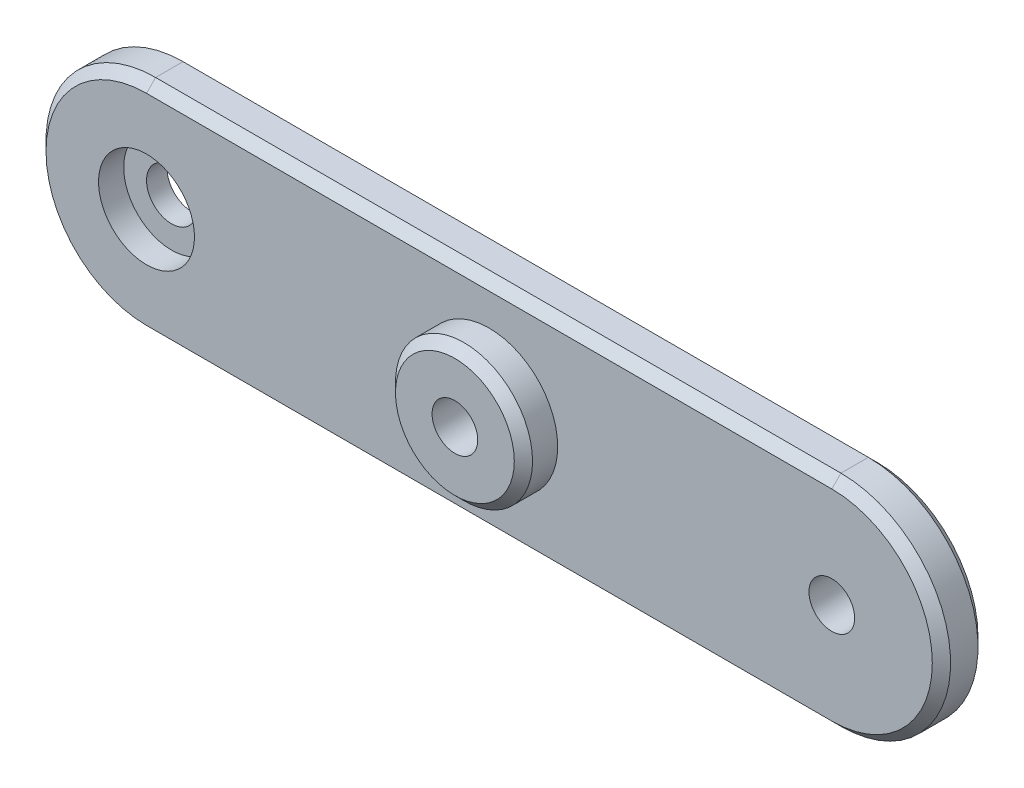
ISO-10303-21;
HEADER;
FILE_DESCRIPTION(('STEP AP214'),'2;1');
FILE_NAME('part.step','',(''),(''),'','','');
FILE_SCHEMA(('AUTOMOTIVE_DESIGN { 1 0 10303 214 1 1 1 1 }'));
ENDSEC;
DATA;
#1=APPLICATION_CONTEXT('core data for automotive mechanical design processes');
#2=APPLICATION_PROTOCOL_DEFINITION('international standard','automotive_design',2000,#1);
#3=PRODUCT_CONTEXT('',#1,'mechanical');
#4=PRODUCT('Part','Part','',(#3));
#5=PRODUCT_RELATED_PRODUCT_CATEGORY('part','',(#4));
#6=PRODUCT_DEFINITION_FORMATION('','',#4);
#7=PRODUCT_DEFINITION_CONTEXT('part definition',#1,'design');
#8=PRODUCT_DEFINITION('design','',#6,#7);
#9=PRODUCT_DEFINITION_SHAPE('','',#8);
#10=(LENGTH_UNIT() NAMED_UNIT(*) SI_UNIT(.MILLI.,.METRE.));
#11=(NAMED_UNIT(*) PLANE_ANGLE_UNIT() SI_UNIT($,.RADIAN.));
#12=(NAMED_UNIT(*) SI_UNIT($,.STERADIAN.) SOLID_ANGLE_UNIT());
#13=UNCERTAINTY_MEASURE_WITH_UNIT(LENGTH_MEASURE(1.E-05),#10,'distance_accuracy_value','');
#14=(GEOMETRIC_REPRESENTATION_CONTEXT(3) GLOBAL_UNCERTAINTY_ASSIGNED_CONTEXT((#13)) GLOBAL_UNIT_ASSIGNED_CONTEXT((#10,
#11,#12)) REPRESENTATION_CONTEXT('',''));
#15=CARTESIAN_POINT('',(0.,0.,0.));
#16=DIRECTION('',(0.,0.,1.));
#17=DIRECTION('',(1.,0.,0.));
#18=AXIS2_PLACEMENT_3D('',#15,#16,#17);
#19=CARTESIAN_POINT('',(-37.5,0.,5.));
#20=DIRECTION('',(0.,0.,-1.));
#21=DIRECTION('',(-1.,0.,0.));
#22=AXIS2_PLACEMENT_3D('',#19,#20,#21);
#23=CYLINDRICAL_SURFACE('',#22,12.);
#24=DIRECTION('',(0.,0.,-1.));
#25=VECTOR('',#24,1.);
#26=CARTESIAN_POINT('',(-37.5,12.,5.));
#27=LINE('',#26,#25);
#28=CARTESIAN_POINT('',(-37.5,12.,4.00000000000001));
#29=VERTEX_POINT('',#28);
#30=CARTESIAN_POINT('',(-37.5,12.,1.));
#31=VERTEX_POINT('',#30);
#32=EDGE_CURVE('E197',#29,#31,#27,.T.);
#33=ORIENTED_EDGE('',*,*,#32,.T.);
#34=CARTESIAN_POINT('',(-37.5,0.,1.));
#35=DIRECTION('',(0.,0.,1.));
#36=DIRECTION('',(1.,0.,0.));
#37=AXIS2_PLACEMENT_3D('',#34,#35,#36);
#38=CIRCLE('',#37,12.);
#39=CARTESIAN_POINT('',(-37.5,-12.,1.));
#40=VERTEX_POINT('',#39);
#41=EDGE_CURVE('E214',#31,#40,#38,.T.);
#42=ORIENTED_EDGE('',*,*,#41,.T.);
#43=DIRECTION('',(0.,0.,-1.));
#44=VECTOR('',#43,1.);
#45=CARTESIAN_POINT('',(-37.5,-12.,5.));
#46=LINE('',#45,#44);
#47=CARTESIAN_POINT('',(-37.5,-12.,4.00000000000001));
#48=VERTEX_POINT('',#47);
#49=EDGE_CURVE('E131',#48,#40,#46,.T.);
#50=ORIENTED_EDGE('',*,*,#49,.F.);
#51=CARTESIAN_POINT('',(-37.5,0.,4.00000000000001));
#52=DIRECTION('',(0.,0.,1.));
#53=DIRECTION('',(1.,0.,0.));
#54=AXIS2_PLACEMENT_3D('',#51,#52,#53);
#55=CIRCLE('',#54,12.);
#56=EDGE_CURVE('E212',#48,#29,#55,.F.);
#57=ORIENTED_EDGE('',*,*,#56,.T.);
#58=EDGE_LOOP('',(#33,#42,#50,#57));
#59=FACE_BOUND('',#58,.T.);
#60=ADVANCED_FACE('F39',(#59),#23,.T.);
#61=CARTESIAN_POINT('',(-37.5,-12.,5.));
#62=DIRECTION('',(0.,1.,0.));
#63=DIRECTION('',(-1.,0.,0.));
#64=AXIS2_PLACEMENT_3D('',#61,#62,#63);
#65=PLANE('',#64);
#66=ORIENTED_EDGE('',*,*,#49,.T.);
#67=DIRECTION('',(1.,0.,0.));
#68=VECTOR('',#67,1.);
#69=CARTESIAN_POINT('',(-37.5,-12.,1.));
#70=LINE('',#69,#68);
#71=CARTESIAN_POINT('',(37.5,-12.,1.));
#72=VERTEX_POINT('',#71);
#73=EDGE_CURVE('E130',#40,#72,#70,.T.);
#74=ORIENTED_EDGE('',*,*,#73,.T.);
#75=DIRECTION('',(0.,0.,-1.));
#76=VECTOR('',#75,1.);
#77=CARTESIAN_POINT('',(37.5,-12.,5.));
#78=LINE('',#77,#76);
#79=CARTESIAN_POINT('',(37.5,-12.,4.00000000000001));
#80=VERTEX_POINT('',#79);
#81=EDGE_CURVE('E113',#80,#72,#78,.T.);
#82=ORIENTED_EDGE('',*,*,#81,.F.);
#83=DIRECTION('',(-1.,0.,0.));
#84=VECTOR('',#83,1.);
#85=CARTESIAN_POINT('',(-37.5,-12.,4.00000000000001));
#86=LINE('',#85,#84);
#87=EDGE_CURVE('E127',#80,#48,#86,.T.);
#88=ORIENTED_EDGE('',*,*,#87,.T.);
#89=EDGE_LOOP('',(#66,#74,#82,#88));
#90=FACE_BOUND('',#89,.T.);
#91=ADVANCED_FACE('F126',(#90),#65,.F.);
#92=CARTESIAN_POINT('',(37.5,0.,5.));
#93=DIRECTION('',(0.,0.,-1.));
#94=DIRECTION('',(-1.,0.,0.));
#95=AXIS2_PLACEMENT_3D('',#92,#93,#94);
#96=CYLINDRICAL_SURFACE('',#95,12.);
#97=ORIENTED_EDGE('',*,*,#81,.T.);
#98=CARTESIAN_POINT('',(37.5,0.,1.));
#99=DIRECTION('',(0.,0.,1.));
#100=DIRECTION('',(1.,0.,0.));
#101=AXIS2_PLACEMENT_3D('',#98,#99,#100);
#102=CIRCLE('',#101,12.);
#103=CARTESIAN_POINT('',(37.5,12.,1.));
#104=VERTEX_POINT('',#103);
#105=EDGE_CURVE('E119',#72,#104,#102,.T.);
#106=ORIENTED_EDGE('',*,*,#105,.T.);
#107=DIRECTION('',(0.,0.,-1.));
#108=VECTOR('',#107,1.);
#109=CARTESIAN_POINT('',(37.5,12.,5.));
#110=LINE('',#109,#108);
#111=CARTESIAN_POINT('',(37.5,12.,4.00000000000001));
#112=VERTEX_POINT('',#111);
#113=EDGE_CURVE('E115',#112,#104,#110,.T.);
#114=ORIENTED_EDGE('',*,*,#113,.F.);
#115=CARTESIAN_POINT('',(37.5,0.,4.00000000000001));
#116=DIRECTION('',(0.,0.,1.));
#117=DIRECTION('',(1.,0.,0.));
#118=AXIS2_PLACEMENT_3D('',#115,#116,#117);
#119=CIRCLE('',#118,12.);
#120=EDGE_CURVE('E110',#112,#80,#119,.F.);
#121=ORIENTED_EDGE('',*,*,#120,.T.);
#122=EDGE_LOOP('',(#97,#106,#114,#121));
#123=FACE_BOUND('',#122,.T.);
#124=ADVANCED_FACE('F112',(#123),#96,.T.);
#125=CARTESIAN_POINT('',(-37.5,12.,5.));
#126=DIRECTION('',(0.,-1.,0.));
#127=DIRECTION('',(1.,0.,0.));
#128=AXIS2_PLACEMENT_3D('',#125,#126,#127);
#129=PLANE('',#128);
#130=ORIENTED_EDGE('',*,*,#113,.T.);
#131=DIRECTION('',(-1.,0.,0.));
#132=VECTOR('',#131,1.);
#133=CARTESIAN_POINT('',(-37.5,12.,1.));
#134=LINE('',#133,#132);
#135=EDGE_CURVE('E218',#104,#31,#134,.T.);
#136=ORIENTED_EDGE('',*,*,#135,.T.);
#137=ORIENTED_EDGE('',*,*,#32,.F.);
#138=DIRECTION('',(1.,0.,0.));
#139=VECTOR('',#138,1.);
#140=CARTESIAN_POINT('',(37.5,12.,4.00000000000001));
#141=LINE('',#140,#139);
#142=EDGE_CURVE('E216',#29,#112,#141,.T.);
#143=ORIENTED_EDGE('',*,*,#142,.T.);
#144=EDGE_LOOP('',(#130,#136,#137,#143));
#145=FACE_BOUND('',#144,.T.);
#146=ADVANCED_FACE('F277',(#145),#129,.F.);
#147=CARTESIAN_POINT('',(-37.5,0.,5.));
#148=DIRECTION('',(0.,0.,1.));
#149=DIRECTION('',(1.,0.,0.));
#150=AXIS2_PLACEMENT_3D('',#147,#148,#149);
#151=PLANE('',#150);
#152=CARTESIAN_POINT('',(-37.5,0.,5.));
#153=DIRECTION('',(0.,0.,1.));
#154=DIRECTION('',(1.,0.,0.));
#155=AXIS2_PLACEMENT_3D('',#152,#153,#154);
#156=CIRCLE('',#155,11.);
#157=CARTESIAN_POINT('',(-37.5,11.,5.));
#158=VERTEX_POINT('',#157);
#159=CARTESIAN_POINT('',(-37.5,-11.,5.));
#160=VERTEX_POINT('',#159);
#161=EDGE_CURVE('E64',#158,#160,#156,.T.);
#162=ORIENTED_EDGE('',*,*,#161,.T.);
#163=DIRECTION('',(1.,0.,0.));
#164=VECTOR('',#163,1.);
#165=CARTESIAN_POINT('',(37.5,-11.,5.));
#166=LINE('',#165,#164);
#167=CARTESIAN_POINT('',(37.5,-11.,5.));
#168=VERTEX_POINT('',#167);
#169=EDGE_CURVE('E224',#160,#168,#166,.T.);
#170=ORIENTED_EDGE('',*,*,#169,.T.);
#171=CARTESIAN_POINT('',(37.5,0.,5.));
#172=DIRECTION('',(0.,0.,1.));
#173=DIRECTION('',(1.,0.,0.));
#174=AXIS2_PLACEMENT_3D('',#171,#172,#173);
#175=CIRCLE('',#174,11.);
#176=CARTESIAN_POINT('',(37.5,11.,5.));
#177=VERTEX_POINT('',#176);
#178=EDGE_CURVE('E138',#168,#177,#175,.T.);
#179=ORIENTED_EDGE('',*,*,#178,.T.);
#180=DIRECTION('',(-1.,0.,0.));
#181=VECTOR('',#180,1.);
#182=CARTESIAN_POINT('',(-37.5,11.,5.));
#183=LINE('',#182,#181);
#184=EDGE_CURVE('E220',#177,#158,#183,.T.);
#185=ORIENTED_EDGE('',*,*,#184,.T.);
#186=EDGE_LOOP('',(#162,#170,#179,#185));
#187=FACE_BOUND('',#186,.T.);
#188=CARTESIAN_POINT('',(37.5,0.,5.));
#189=DIRECTION('',(0.,0.,1.));
#190=DIRECTION('',(1.,0.,0.));
#191=AXIS2_PLACEMENT_3D('',#188,#189,#190);
#192=CIRCLE('',#191,2.5);
#193=CARTESIAN_POINT('',(40.,0.,5.));
#194=VERTEX_POINT('',#193);
#195=EDGE_CURVE('E163',#194,#194,#192,.T.);
#196=ORIENTED_EDGE('',*,*,#195,.F.);
#197=EDGE_LOOP('',(#196));
#198=FACE_BOUND('',#197,.T.);
#199=CARTESIAN_POINT('',(-37.5,0.,5.));
#200=DIRECTION('',(0.,0.,1.));
#201=DIRECTION('',(1.,0.,0.));
#202=AXIS2_PLACEMENT_3D('',#199,#200,#201);
#203=CIRCLE('',#202,5.25);
#204=CARTESIAN_POINT('',(-32.25,0.,5.));
#205=VERTEX_POINT('',#204);
#206=EDGE_CURVE('E174',#205,#205,#203,.T.);
#207=ORIENTED_EDGE('',*,*,#206,.F.);
#208=EDGE_LOOP('',(#207));
#209=FACE_BOUND('',#208,.T.);
#210=CARTESIAN_POINT('',(0.,0.,5.));
#211=DIRECTION('',(0.,0.,1.));
#212=DIRECTION('',(1.,0.,0.));
#213=AXIS2_PLACEMENT_3D('',#210,#211,#212);
#214=CIRCLE('',#213,7.5);
#215=CARTESIAN_POINT('',(7.5,0.,5.));
#216=VERTEX_POINT('',#215);
#217=EDGE_CURVE('E194',#216,#216,#214,.F.);
#218=ORIENTED_EDGE('',*,*,#217,.T.);
#219=EDGE_LOOP('',(#218));
#220=FACE_BOUND('',#219,.T.);
#221=ADVANCED_FACE('F273',(#187,#198,#209,#220),#151,.T.);
#222=CARTESIAN_POINT('',(-37.5,0.,0.));
#223=DIRECTION('',(0.,0.,1.));
#224=DIRECTION('',(1.,0.,0.));
#225=AXIS2_PLACEMENT_3D('',#222,#223,#224);
#226=PLANE('',#225);
#227=CARTESIAN_POINT('',(37.5,0.,0.));
#228=DIRECTION('',(0.,0.,1.));
#229=DIRECTION('',(1.,0.,0.));
#230=AXIS2_PLACEMENT_3D('',#227,#228,#229);
#231=CIRCLE('',#230,11.);
#232=CARTESIAN_POINT('',(37.5,11.,0.));
#233=VERTEX_POINT('',#232);
#234=CARTESIAN_POINT('',(37.5,-11.,0.));
#235=VERTEX_POINT('',#234);
#236=EDGE_CURVE('E207',#233,#235,#231,.F.);
#237=ORIENTED_EDGE('',*,*,#236,.T.);
#238=DIRECTION('',(-1.,0.,0.));
#239=VECTOR('',#238,1.);
#240=CARTESIAN_POINT('',(-37.5,-11.,0.));
#241=LINE('',#240,#239);
#242=CARTESIAN_POINT('',(-37.5,-11.,0.));
#243=VERTEX_POINT('',#242);
#244=EDGE_CURVE('E120',#235,#243,#241,.T.);
#245=ORIENTED_EDGE('',*,*,#244,.T.);
#246=CARTESIAN_POINT('',(-37.5,0.,0.));
#247=DIRECTION('',(0.,0.,1.));
#248=DIRECTION('',(1.,0.,0.));
#249=AXIS2_PLACEMENT_3D('',#246,#247,#248);
#250=CIRCLE('',#249,11.);
#251=CARTESIAN_POINT('',(-37.5,11.,0.));
#252=VERTEX_POINT('',#251);
#253=EDGE_CURVE('E205',#243,#252,#250,.F.);
#254=ORIENTED_EDGE('',*,*,#253,.T.);
#255=DIRECTION('',(1.,0.,0.));
#256=VECTOR('',#255,1.);
#257=CARTESIAN_POINT('',(-37.5,11.,0.));
#258=LINE('',#257,#256);
#259=EDGE_CURVE('E203',#252,#233,#258,.T.);
#260=ORIENTED_EDGE('',*,*,#259,.T.);
#261=EDGE_LOOP('',(#237,#245,#254,#260));
#262=FACE_BOUND('',#261,.T.);
#263=CARTESIAN_POINT('',(37.5,0.,0.));
#264=DIRECTION('',(0.,0.,1.));
#265=DIRECTION('',(1.,0.,0.));
#266=AXIS2_PLACEMENT_3D('',#263,#264,#265);
#267=CIRCLE('',#266,2.5);
#268=CARTESIAN_POINT('',(40.,0.,0.));
#269=VERTEX_POINT('',#268);
#270=EDGE_CURVE('E169',#269,#269,#267,.T.);
#271=ORIENTED_EDGE('',*,*,#270,.T.);
#272=EDGE_LOOP('',(#271));
#273=FACE_BOUND('',#272,.T.);
#274=CARTESIAN_POINT('',(-37.5,0.,0.));
#275=DIRECTION('',(0.,0.,1.));
#276=DIRECTION('',(1.,0.,0.));
#277=AXIS2_PLACEMENT_3D('',#274,#275,#276);
#278=CIRCLE('',#277,2.75);
#279=CARTESIAN_POINT('',(-34.75,0.,0.));
#280=VERTEX_POINT('',#279);
#281=EDGE_CURVE('E185',#280,#280,#278,.T.);
#282=ORIENTED_EDGE('',*,*,#281,.T.);
#283=EDGE_LOOP('',(#282));
#284=FACE_BOUND('',#283,.T.);
#285=CARTESIAN_POINT('',(0.,0.,0.));
#286=DIRECTION('',(0.,0.,1.));
#287=DIRECTION('',(1.,0.,0.));
#288=AXIS2_PLACEMENT_3D('',#285,#286,#287);
#289=CIRCLE('',#288,2.5);
#290=CARTESIAN_POINT('',(2.5,0.,0.));
#291=VERTEX_POINT('',#290);
#292=EDGE_CURVE('E191',#291,#291,#289,.T.);
#293=ORIENTED_EDGE('',*,*,#292,.T.);
#294=EDGE_LOOP('',(#293));
#295=FACE_BOUND('',#294,.T.);
#296=ADVANCED_FACE('F276',(#262,#273,#284,#295),#226,.F.);
#297=CARTESIAN_POINT('',(0.,0.,8.75));
#298=DIRECTION('',(0.,0.,-1.));
#299=DIRECTION('',(-1.,0.,0.));
#300=AXIS2_PLACEMENT_3D('',#297,#298,#299);
#301=CYLINDRICAL_SURFACE('',#300,7.5);
#302=CARTESIAN_POINT('',(0.,0.,7.74999999999999));
#303=DIRECTION('',(0.,0.,1.));
#304=DIRECTION('',(1.,0.,0.));
#305=AXIS2_PLACEMENT_3D('',#302,#303,#304);
#306=CIRCLE('',#305,7.5);
#307=CARTESIAN_POINT('',(7.5,0.,7.74999999999999));
#308=VERTEX_POINT('',#307);
#309=EDGE_CURVE('E11',#308,#308,#306,.F.);
#310=ORIENTED_EDGE('',*,*,#309,.T.);
#311=EDGE_LOOP('',(#310));
#312=FACE_BOUND('',#311,.T.);
#313=ORIENTED_EDGE('',*,*,#217,.F.);
#314=EDGE_LOOP('',(#313));
#315=FACE_BOUND('',#314,.T.);
#316=ADVANCED_FACE('F284',(#312,#315),#301,.T.);
#317=CARTESIAN_POINT('',(0.,0.,8.75));
#318=DIRECTION('',(0.,0.,1.));
#319=DIRECTION('',(1.,0.,0.));
#320=AXIS2_PLACEMENT_3D('',#317,#318,#319);
#321=PLANE('',#320);
#322=CARTESIAN_POINT('',(0.,0.,8.75));
#323=DIRECTION('',(0.,0.,1.));
#324=DIRECTION('',(1.,0.,0.));
#325=AXIS2_PLACEMENT_3D('',#322,#323,#324);
#326=CIRCLE('',#325,6.49999999999999);
#327=CARTESIAN_POINT('',(6.49999999999999,0.,8.75));
#328=VERTEX_POINT('',#327);
#329=EDGE_CURVE('E48',#328,#328,#326,.T.);
#330=ORIENTED_EDGE('',*,*,#329,.T.);
#331=EDGE_LOOP('',(#330));
#332=FACE_BOUND('',#331,.T.);
#333=CARTESIAN_POINT('',(0.,0.,8.75));
#334=DIRECTION('',(0.,0.,1.));
#335=DIRECTION('',(1.,0.,0.));
#336=AXIS2_PLACEMENT_3D('',#333,#334,#335);
#337=CIRCLE('',#336,2.5);
#338=CARTESIAN_POINT('',(2.5,0.,8.75));
#339=VERTEX_POINT('',#338);
#340=EDGE_CURVE('E188',#339,#339,#337,.T.);
#341=ORIENTED_EDGE('',*,*,#340,.F.);
#342=EDGE_LOOP('',(#341));
#343=FACE_BOUND('',#342,.T.);
#344=ADVANCED_FACE('F228',(#332,#343),#321,.T.);
#345=CARTESIAN_POINT('',(0.,0.,-1.25));
#346=DIRECTION('',(0.,0.,1.));
#347=DIRECTION('',(1.,0.,0.));
#348=AXIS2_PLACEMENT_3D('',#345,#346,#347);
#349=CYLINDRICAL_SURFACE('',#348,2.5);
#350=ORIENTED_EDGE('',*,*,#340,.T.);
#351=EDGE_LOOP('',(#350));
#352=FACE_BOUND('',#351,.T.);
#353=ORIENTED_EDGE('',*,*,#292,.F.);
#354=EDGE_LOOP('',(#353));
#355=FACE_BOUND('',#354,.T.);
#356=ADVANCED_FACE('F292',(#352,#355),#349,.F.);
#357=CARTESIAN_POINT('',(-37.5,0.,5.));
#358=DIRECTION('',(0.,0.,1.));
#359=DIRECTION('',(1.,0.,0.));
#360=AXIS2_PLACEMENT_3D('',#357,#358,#359);
#361=CYLINDRICAL_SURFACE('',#360,2.75000000000001);
#362=ORIENTED_EDGE('',*,*,#281,.F.);
#363=EDGE_LOOP('',(#362));
#364=FACE_BOUND('',#363,.T.);
#365=CARTESIAN_POINT('',(-37.5,0.,2.25));
#366=DIRECTION('',(0.,0.,1.));
#367=DIRECTION('',(1.,0.,0.));
#368=AXIS2_PLACEMENT_3D('',#365,#366,#367);
#369=CIRCLE('',#368,2.75000000000001);
#370=CARTESIAN_POINT('',(-34.75,0.,2.25));
#371=VERTEX_POINT('',#370);
#372=EDGE_CURVE('E182',#371,#371,#369,.T.);
#373=ORIENTED_EDGE('',*,*,#372,.T.);
#374=EDGE_LOOP('',(#373));
#375=FACE_BOUND('',#374,.T.);
#376=ADVANCED_FACE('F335',(#364,#375),#361,.F.);
#377=CARTESIAN_POINT('',(-34.75,0.,2.25));
#378=DIRECTION('',(0.,0.,-1.));
#379=DIRECTION('',(-1.,0.,0.));
#380=AXIS2_PLACEMENT_3D('',#377,#378,#379);
#381=PLANE('',#380);
#382=ORIENTED_EDGE('',*,*,#372,.F.);
#383=EDGE_LOOP('',(#382));
#384=FACE_BOUND('',#383,.T.);
#385=CARTESIAN_POINT('',(-37.5,0.,2.25));
#386=DIRECTION('',(0.,0.,1.));
#387=DIRECTION('',(1.,0.,0.));
#388=AXIS2_PLACEMENT_3D('',#385,#386,#387);
#389=CIRCLE('',#388,5.25);
#390=CARTESIAN_POINT('',(-32.25,0.,2.25));
#391=VERTEX_POINT('',#390);
#392=EDGE_CURVE('E179',#391,#391,#389,.T.);
#393=ORIENTED_EDGE('',*,*,#392,.T.);
#394=EDGE_LOOP('',(#393));
#395=FACE_BOUND('',#394,.T.);
#396=ADVANCED_FACE('F344',(#384,#395),#381,.F.);
#397=CARTESIAN_POINT('',(-37.5,0.,5.));
#398=DIRECTION('',(0.,0.,1.));
#399=DIRECTION('',(1.,0.,0.));
#400=AXIS2_PLACEMENT_3D('',#397,#398,#399);
#401=CYLINDRICAL_SURFACE('',#400,5.25);
#402=ORIENTED_EDGE('',*,*,#392,.F.);
#403=EDGE_LOOP('',(#402));
#404=FACE_BOUND('',#403,.T.);
#405=ORIENTED_EDGE('',*,*,#206,.T.);
#406=EDGE_LOOP('',(#405));
#407=FACE_BOUND('',#406,.T.);
#408=ADVANCED_FACE('F354',(#404,#407),#401,.F.);
#409=CARTESIAN_POINT('',(37.5,0.,-5.));
#410=DIRECTION('',(0.,0.,1.));
#411=DIRECTION('',(1.,0.,0.));
#412=AXIS2_PLACEMENT_3D('',#409,#410,#411);
#413=CYLINDRICAL_SURFACE('',#412,2.5);
#414=ORIENTED_EDGE('',*,*,#195,.T.);
#415=EDGE_LOOP('',(#414));
#416=FACE_BOUND('',#415,.T.);
#417=ORIENTED_EDGE('',*,*,#270,.F.);
#418=EDGE_LOOP('',(#417));
#419=FACE_BOUND('',#418,.T.);
#420=ADVANCED_FACE('F260',(#416,#419),#413,.F.);
#421=CARTESIAN_POINT('',(-37.5,12.,1.));
#422=DIRECTION('',(0.,-0.707106781186547,0.707106781186547));
#423=DIRECTION('',(-1.,0.,0.));
#424=AXIS2_PLACEMENT_3D('',#421,#422,#423);
#425=PLANE('',#424);
#426=DIRECTION('',(0.,0.707106781186547,0.707106781186547));
#427=VECTOR('',#426,1.);
#428=CARTESIAN_POINT('',(37.5,11.,0.));
#429=LINE('',#428,#427);
#430=EDGE_CURVE('E155',#233,#104,#429,.T.);
#431=ORIENTED_EDGE('',*,*,#430,.F.);
#432=ORIENTED_EDGE('',*,*,#259,.F.);
#433=DIRECTION('',(0.,-0.707106781186547,-0.707106781186547));
#434=VECTOR('',#433,1.);
#435=CARTESIAN_POINT('',(-37.5,12.,1.));
#436=LINE('',#435,#434);
#437=EDGE_CURVE('E143',#31,#252,#436,.T.);
#438=ORIENTED_EDGE('',*,*,#437,.F.);
#439=ORIENTED_EDGE('',*,*,#135,.F.);
#440=EDGE_LOOP('',(#431,#432,#438,#439));
#441=FACE_BOUND('',#440,.T.);
#442=ADVANCED_FACE('F258',(#441),#425,.F.);
#443=CARTESIAN_POINT('',(-37.5,0.,1.));
#444=DIRECTION('',(0.,0.,1.));
#445=DIRECTION('',(1.,0.,0.));
#446=AXIS2_PLACEMENT_3D('',#443,#444,#445);
#447=CONICAL_SURFACE('',#446,12.,0.785398163397448);
#448=ORIENTED_EDGE('',*,*,#437,.T.);
#449=ORIENTED_EDGE('',*,*,#253,.F.);
#450=DIRECTION('',(0.,0.707106781186547,-0.707106781186547));
#451=VECTOR('',#450,1.);
#452=CARTESIAN_POINT('',(-37.5,-12.,1.));
#453=LINE('',#452,#451);
#454=EDGE_CURVE('E149',#40,#243,#453,.T.);
#455=ORIENTED_EDGE('',*,*,#454,.F.);
#456=ORIENTED_EDGE('',*,*,#41,.F.);
#457=EDGE_LOOP('',(#448,#449,#455,#456));
#458=FACE_BOUND('',#457,.T.);
#459=ADVANCED_FACE('F255',(#458),#447,.T.);
#460=CARTESIAN_POINT('',(37.5,0.,1.));
#461=DIRECTION('',(0.,0.,1.));
#462=DIRECTION('',(1.,0.,0.));
#463=AXIS2_PLACEMENT_3D('',#460,#461,#462);
#464=CONICAL_SURFACE('',#463,12.,0.785398163397448);
#465=ORIENTED_EDGE('',*,*,#430,.T.);
#466=ORIENTED_EDGE('',*,*,#105,.F.);
#467=DIRECTION('',(0.,-0.707106781186547,0.707106781186547));
#468=VECTOR('',#467,1.);
#469=CARTESIAN_POINT('',(37.5,-11.,0.));
#470=LINE('',#469,#468);
#471=EDGE_CURVE('E146',#235,#72,#470,.T.);
#472=ORIENTED_EDGE('',*,*,#471,.F.);
#473=ORIENTED_EDGE('',*,*,#236,.F.);
#474=EDGE_LOOP('',(#465,#466,#472,#473));
#475=FACE_BOUND('',#474,.T.);
#476=ADVANCED_FACE('F252',(#475),#464,.T.);
#477=CARTESIAN_POINT('',(-37.5,-12.,1.));
#478=DIRECTION('',(0.,0.707106781186547,0.707106781186547));
#479=DIRECTION('',(1.,0.,0.));
#480=AXIS2_PLACEMENT_3D('',#477,#478,#479);
#481=PLANE('',#480);
#482=ORIENTED_EDGE('',*,*,#454,.T.);
#483=ORIENTED_EDGE('',*,*,#244,.F.);
#484=ORIENTED_EDGE('',*,*,#471,.T.);
#485=ORIENTED_EDGE('',*,*,#73,.F.);
#486=EDGE_LOOP('',(#482,#483,#484,#485));
#487=FACE_BOUND('',#486,.T.);
#488=ADVANCED_FACE('F248',(#487),#481,.F.);
#489=CARTESIAN_POINT('',(-37.5,11.,5.));
#490=DIRECTION('',(0.,0.707106781186547,0.707106781186547));
#491=DIRECTION('',(1.,0.,0.));
#492=AXIS2_PLACEMENT_3D('',#489,#490,#491);
#493=PLANE('',#492);
#494=DIRECTION('',(0.,-0.707106781186547,0.707106781186547));
#495=VECTOR('',#494,1.);
#496=CARTESIAN_POINT('',(37.5,12.,4.00000000000001));
#497=LINE('',#496,#495);
#498=EDGE_CURVE('E140',#112,#177,#497,.T.);
#499=ORIENTED_EDGE('',*,*,#498,.F.);
#500=ORIENTED_EDGE('',*,*,#142,.F.);
#501=DIRECTION('',(0.,0.707106781186547,-0.707106781186547));
#502=VECTOR('',#501,1.);
#503=CARTESIAN_POINT('',(-37.5,11.,5.));
#504=LINE('',#503,#502);
#505=EDGE_CURVE('E43',#158,#29,#504,.T.);
#506=ORIENTED_EDGE('',*,*,#505,.F.);
#507=ORIENTED_EDGE('',*,*,#184,.F.);
#508=EDGE_LOOP('',(#499,#500,#506,#507));
#509=FACE_BOUND('',#508,.T.);
#510=ADVANCED_FACE('F251',(#509),#493,.T.);
#511=CARTESIAN_POINT('',(-37.5,0.,5.));
#512=DIRECTION('',(0.,0.,-1.));
#513=DIRECTION('',(-1.,0.,0.));
#514=AXIS2_PLACEMENT_3D('',#511,#512,#513);
#515=CONICAL_SURFACE('',#514,11.,0.785398163397448);
#516=ORIENTED_EDGE('',*,*,#505,.T.);
#517=ORIENTED_EDGE('',*,*,#56,.F.);
#518=DIRECTION('',(0.,-0.707106781186547,-0.707106781186547));
#519=VECTOR('',#518,1.);
#520=CARTESIAN_POINT('',(-37.5,-11.,5.));
#521=LINE('',#520,#519);
#522=EDGE_CURVE('E134',#160,#48,#521,.T.);
#523=ORIENTED_EDGE('',*,*,#522,.F.);
#524=ORIENTED_EDGE('',*,*,#161,.F.);
#525=EDGE_LOOP('',(#516,#517,#523,#524));
#526=FACE_BOUND('',#525,.T.);
#527=ADVANCED_FACE('F265',(#526),#515,.T.);
#528=CARTESIAN_POINT('',(37.5,0.,5.));
#529=DIRECTION('',(0.,0.,-1.));
#530=DIRECTION('',(-1.,0.,0.));
#531=AXIS2_PLACEMENT_3D('',#528,#529,#530);
#532=CONICAL_SURFACE('',#531,11.,0.785398163397448);
#533=ORIENTED_EDGE('',*,*,#498,.T.);
#534=ORIENTED_EDGE('',*,*,#178,.F.);
#535=DIRECTION('',(0.,0.707106781186547,0.707106781186547));
#536=VECTOR('',#535,1.);
#537=CARTESIAN_POINT('',(37.5,-12.,4.00000000000001));
#538=LINE('',#537,#536);
#539=EDGE_CURVE('E56',#80,#168,#538,.T.);
#540=ORIENTED_EDGE('',*,*,#539,.F.);
#541=ORIENTED_EDGE('',*,*,#120,.F.);
#542=EDGE_LOOP('',(#533,#534,#540,#541));
#543=FACE_BOUND('',#542,.T.);
#544=ADVANCED_FACE('F137',(#543),#532,.T.);
#545=CARTESIAN_POINT('',(-37.5,-11.,5.));
#546=DIRECTION('',(0.,-0.707106781186547,0.707106781186547));
#547=DIRECTION('',(-1.,0.,0.));
#548=AXIS2_PLACEMENT_3D('',#545,#546,#547);
#549=PLANE('',#548);
#550=ORIENTED_EDGE('',*,*,#522,.T.);
#551=ORIENTED_EDGE('',*,*,#87,.F.);
#552=ORIENTED_EDGE('',*,*,#539,.T.);
#553=ORIENTED_EDGE('',*,*,#169,.F.);
#554=EDGE_LOOP('',(#550,#551,#552,#553));
#555=FACE_BOUND('',#554,.T.);
#556=ADVANCED_FACE('F133',(#555),#549,.T.);
#557=CARTESIAN_POINT('',(0.,0.,8.75));
#558=DIRECTION('',(0.,0.,-1.));
#559=DIRECTION('',(-1.,0.,0.));
#560=AXIS2_PLACEMENT_3D('',#557,#558,#559);
#561=CONICAL_SURFACE('',#560,6.49999999999999,0.785398163397449);
#562=ORIENTED_EDGE('',*,*,#309,.F.);
#563=EDGE_LOOP('',(#562));
#564=FACE_BOUND('',#563,.T.);
#565=ORIENTED_EDGE('',*,*,#329,.F.);
#566=EDGE_LOOP('',(#565));
#567=FACE_BOUND('',#566,.T.);
#568=ADVANCED_FACE('F41',(#564,#567),#561,.T.);
#569=CLOSED_SHELL('',(#60,#91,#124,#146,#221,#296,#316,#344,#356,#376,#396,#408,#420,#442,#459,
#476,#488,#510,#527,#544,#556,#568));
#570=MANIFOLD_SOLID_BREP('B2',#569);
#571=ADVANCED_BREP_SHAPE_REPRESENTATION('',(#18,#570),#14);
#572=SHAPE_DEFINITION_REPRESENTATION(#9,#571);
ENDSEC;
END-ISO-10303-21;
